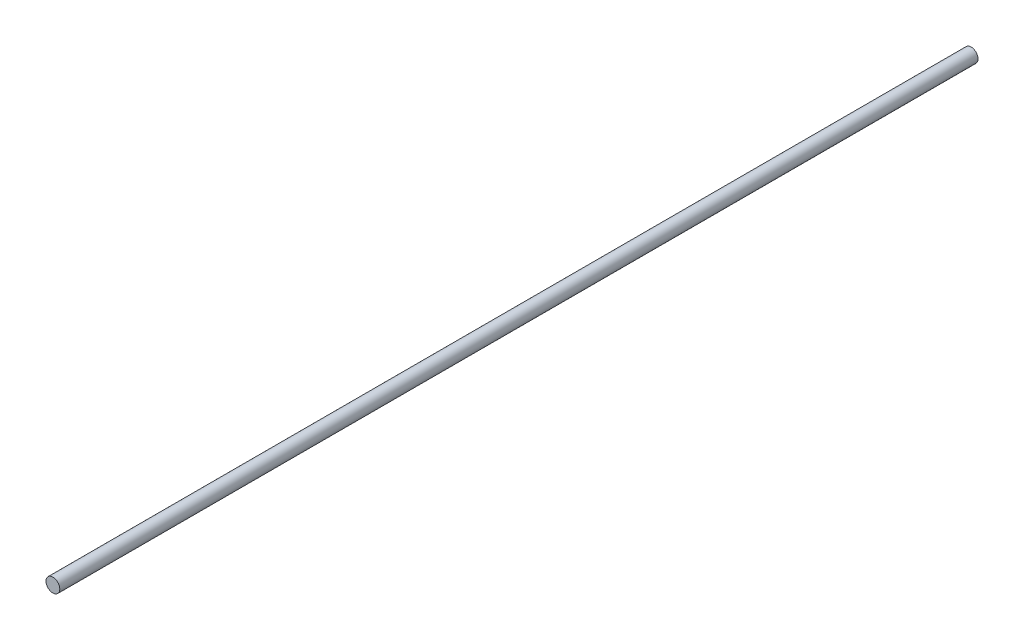
ISO-10303-21;
HEADER;
FILE_DESCRIPTION(('STEP AP214'),'2;1');
FILE_NAME('part.step','',(''),(''),'','','');
FILE_SCHEMA(('AUTOMOTIVE_DESIGN { 1 0 10303 214 1 1 1 1 }'));
ENDSEC;
DATA;
#1=APPLICATION_CONTEXT('core data for automotive mechanical design processes');
#2=APPLICATION_PROTOCOL_DEFINITION('international standard','automotive_design',2000,#1);
#3=PRODUCT_CONTEXT('',#1,'mechanical');
#4=PRODUCT('Part','Part','',(#3));
#5=PRODUCT_RELATED_PRODUCT_CATEGORY('part','',(#4));
#6=PRODUCT_DEFINITION_FORMATION('','',#4);
#7=PRODUCT_DEFINITION_CONTEXT('part definition',#1,'design');
#8=PRODUCT_DEFINITION('design','',#6,#7);
#9=PRODUCT_DEFINITION_SHAPE('','',#8);
#10=(LENGTH_UNIT() NAMED_UNIT(*) SI_UNIT(.MILLI.,.METRE.));
#11=(NAMED_UNIT(*) PLANE_ANGLE_UNIT() SI_UNIT($,.RADIAN.));
#12=(NAMED_UNIT(*) SI_UNIT($,.STERADIAN.) SOLID_ANGLE_UNIT());
#13=UNCERTAINTY_MEASURE_WITH_UNIT(LENGTH_MEASURE(1.E-05),#10,'distance_accuracy_value','');
#14=(GEOMETRIC_REPRESENTATION_CONTEXT(3) GLOBAL_UNCERTAINTY_ASSIGNED_CONTEXT((#13)) GLOBAL_UNIT_ASSIGNED_CONTEXT((#10,
#11,#12)) REPRESENTATION_CONTEXT('',''));
#15=CARTESIAN_POINT('',(0.,0.,0.));
#16=DIRECTION('',(0.,0.,1.));
#17=DIRECTION('',(1.,0.,0.));
#18=AXIS2_PLACEMENT_3D('',#15,#16,#17);
#19=CARTESIAN_POINT('',(0.,0.,635.));
#20=DIRECTION('',(0.,0.,-1.));
#21=DIRECTION('',(-1.,0.,0.));
#22=AXIS2_PLACEMENT_3D('',#19,#20,#21);
#23=CYLINDRICAL_SURFACE('',#22,4.7625);
#24=CARTESIAN_POINT('',(0.,0.,635.));
#25=DIRECTION('',(0.,0.,1.));
#26=DIRECTION('',(1.,0.,0.));
#27=AXIS2_PLACEMENT_3D('',#24,#25,#26);
#28=CIRCLE('',#27,4.7625);
#29=CARTESIAN_POINT('',(-4.7625,0.,635.));
#30=VERTEX_POINT('',#29);
#31=EDGE_CURVE('E10',#30,#30,#28,.T.);
#32=CARTESIAN_POINT('',(0.,0.,0.));
#33=DIRECTION('',(0.,0.,1.));
#34=DIRECTION('',(1.,0.,0.));
#35=AXIS2_PLACEMENT_3D('',#32,#33,#34);
#36=CIRCLE('',#35,4.7625);
#37=CARTESIAN_POINT('',(-4.7625,0.,-1.11022302462516E-13));
#38=VERTEX_POINT('',#37);
#39=EDGE_CURVE('E40',#38,#38,#36,.T.);
#40=CARTESIAN_POINT('',(-4.7625,0.,635.));
#41=CARTESIAN_POINT('',(-4.7625,0.,628.385416666667));
#42=CARTESIAN_POINT('',(-4.7625,0.,621.770833333333));
#43=CARTESIAN_POINT('',(-4.7625,0.,608.541666666667));
#44=CARTESIAN_POINT('',(-4.7625,0.,601.927083333333));
#45=CARTESIAN_POINT('',(-4.7625,0.,588.697916666667));
#46=CARTESIAN_POINT('',(-4.7625,0.,582.083333333333));
#47=CARTESIAN_POINT('',(-4.7625,0.,568.854166666667));
#48=CARTESIAN_POINT('',(-4.7625,0.,562.239583333333));
#49=CARTESIAN_POINT('',(-4.7625,0.,549.010416666667));
#50=CARTESIAN_POINT('',(-4.7625,0.,542.395833333333));
#51=CARTESIAN_POINT('',(-4.7625,0.,529.166666666667));
#52=CARTESIAN_POINT('',(-4.7625,0.,522.552083333333));
#53=CARTESIAN_POINT('',(-4.7625,0.,509.322916666667));
#54=CARTESIAN_POINT('',(-4.7625,0.,502.708333333333));
#55=CARTESIAN_POINT('',(-4.7625,0.,489.479166666667));
#56=CARTESIAN_POINT('',(-4.7625,0.,482.864583333333));
#57=CARTESIAN_POINT('',(-4.7625,0.,469.635416666667));
#58=CARTESIAN_POINT('',(-4.7625,0.,463.020833333333));
#59=CARTESIAN_POINT('',(-4.7625,0.,449.791666666667));
#60=CARTESIAN_POINT('',(-4.7625,0.,443.177083333333));
#61=CARTESIAN_POINT('',(-4.7625,0.,429.947916666667));
#62=CARTESIAN_POINT('',(-4.7625,0.,423.333333333333));
#63=CARTESIAN_POINT('',(-4.7625,0.,410.104166666667));
#64=CARTESIAN_POINT('',(-4.7625,0.,403.489583333333));
#65=CARTESIAN_POINT('',(-4.7625,0.,390.260416666667));
#66=CARTESIAN_POINT('',(-4.7625,0.,383.645833333333));
#67=CARTESIAN_POINT('',(-4.7625,0.,370.416666666667));
#68=CARTESIAN_POINT('',(-4.7625,0.,363.802083333333));
#69=CARTESIAN_POINT('',(-4.7625,0.,350.572916666667));
#70=CARTESIAN_POINT('',(-4.7625,0.,343.958333333333));
#71=CARTESIAN_POINT('',(-4.7625,0.,330.729166666667));
#72=CARTESIAN_POINT('',(-4.7625,0.,324.114583333333));
#73=CARTESIAN_POINT('',(-4.7625,0.,310.885416666667));
#74=CARTESIAN_POINT('',(-4.7625,0.,304.270833333333));
#75=CARTESIAN_POINT('',(-4.7625,0.,291.041666666667));
#76=CARTESIAN_POINT('',(-4.7625,0.,284.427083333333));
#77=CARTESIAN_POINT('',(-4.7625,0.,271.197916666667));
#78=CARTESIAN_POINT('',(-4.7625,0.,264.583333333333));
#79=CARTESIAN_POINT('',(-4.7625,0.,251.354166666667));
#80=CARTESIAN_POINT('',(-4.7625,0.,244.739583333333));
#81=CARTESIAN_POINT('',(-4.7625,0.,231.510416666667));
#82=CARTESIAN_POINT('',(-4.7625,0.,224.895833333333));
#83=CARTESIAN_POINT('',(-4.7625,0.,211.666666666667));
#84=CARTESIAN_POINT('',(-4.7625,0.,205.052083333333));
#85=CARTESIAN_POINT('',(-4.7625,0.,191.822916666666));
#86=CARTESIAN_POINT('',(-4.7625,0.,185.208333333333));
#87=CARTESIAN_POINT('',(-4.7625,0.,171.979166666666));
#88=CARTESIAN_POINT('',(-4.7625,0.,165.364583333333));
#89=CARTESIAN_POINT('',(-4.7625,0.,152.135416666666));
#90=CARTESIAN_POINT('',(-4.7625,0.,145.520833333333));
#91=CARTESIAN_POINT('',(-4.7625,0.,132.291666666667));
#92=CARTESIAN_POINT('',(-4.7625,0.,125.677083333333));
#93=CARTESIAN_POINT('',(-4.7625,0.,112.447916666667));
#94=CARTESIAN_POINT('',(-4.7625,0.,105.833333333333));
#95=CARTESIAN_POINT('',(-4.7625,0.,92.6041666666666));
#96=CARTESIAN_POINT('',(-4.7625,0.,85.9895833333332));
#97=CARTESIAN_POINT('',(-4.7625,0.,72.7604166666665));
#98=CARTESIAN_POINT('',(-4.7625,0.,66.1458333333332));
#99=CARTESIAN_POINT('',(-4.7625,0.,52.9166666666666));
#100=CARTESIAN_POINT('',(-4.7625,0.,46.3020833333332));
#101=CARTESIAN_POINT('',(-4.7625,0.,33.0729166666666));
#102=CARTESIAN_POINT('',(-4.7625,0.,26.4583333333333));
#103=CARTESIAN_POINT('',(-4.7625,0.,13.2291666666666));
#104=CARTESIAN_POINT('',(-4.7625,0.,6.61458333333324));
#105=CARTESIAN_POINT('',(-4.7625,0.,-1.11022302462516E-13));
#106=B_SPLINE_CURVE_WITH_KNOTS('',3,(#40,#41,#42,#43,#44,#45,#46,#47,#48,#49,#50,#51,#52,#53,
#54,#55,#56,#57,#58,#59,#60,#61,#62,#63,#64,#65,#66,#67,#68,#69,#70,#71,#72,#73,#74,#75,#76,#77,
#78,#79,#80,#81,#82,#83,#84,#85,#86,#87,#88,#89,#90,#91,#92,#93,#94,#95,#96,#97,#98,#99,#100,
#101,#102,#103,#104,#105),.UNSPECIFIED.,.F.,.F.,(4,2,2,2,2,2,2,2,2,2,2,2,2,2,2,2,2,2,2,2,2,2,2,
2,2,2,2,2,2,2,2,2,4),(0.,19.84375,39.6875000000001,59.53125,79.3750000000001,99.2187500000001,
119.0625,138.90625,158.75,178.59375,198.4375,218.28125,238.125,257.96875,277.8125,297.65625,
317.5,337.34375,357.1875,377.03125,396.875,416.71875,436.5625,456.40625,476.25,496.09375,
515.9375,535.78125,555.625,575.46875,595.3125,615.15625,635.),.UNSPECIFIED.);
#107=EDGE_CURVE('BSEAM37',#30,#38,#106,.T.);
#108=ORIENTED_EDGE('',*,*,#31,.F.);
#109=ORIENTED_EDGE('',*,*,#39,.T.);
#110=ORIENTED_EDGE('',*,*,#107,.T.);
#111=ORIENTED_EDGE('',*,*,#107,.F.);
#112=EDGE_LOOP('',(#108,#110,#109,#111));
#113=FACE_BOUND('',#112,.T.);
#114=ADVANCED_FACE('F37',(#113),#23,.T.);
#115=CARTESIAN_POINT('',(0.,0.,635.));
#116=DIRECTION('',(0.,0.,1.));
#117=DIRECTION('',(1.,0.,0.));
#118=AXIS2_PLACEMENT_3D('',#115,#116,#117);
#119=PLANE('',#118);
#120=ORIENTED_EDGE('',*,*,#31,.T.);
#121=EDGE_LOOP('',(#120));
#122=FACE_BOUND('',#121,.T.);
#123=ADVANCED_FACE('F54',(#122),#119,.T.);
#124=CARTESIAN_POINT('',(0.,0.,0.));
#125=DIRECTION('',(0.,0.,1.));
#126=DIRECTION('',(1.,0.,0.));
#127=AXIS2_PLACEMENT_3D('',#124,#125,#126);
#128=PLANE('',#127);
#129=ORIENTED_EDGE('',*,*,#39,.F.);
#130=EDGE_LOOP('',(#129));
#131=FACE_BOUND('',#130,.T.);
#132=ADVANCED_FACE('F52',(#131),#128,.F.);
#133=CLOSED_SHELL('',(#114,#123,#132));
#134=MANIFOLD_SOLID_BREP('B2',#133);
#135=ADVANCED_BREP_SHAPE_REPRESENTATION('',(#18,#134),#14);
#136=SHAPE_DEFINITION_REPRESENTATION(#9,#135);
ENDSEC;
END-ISO-10303-21;
